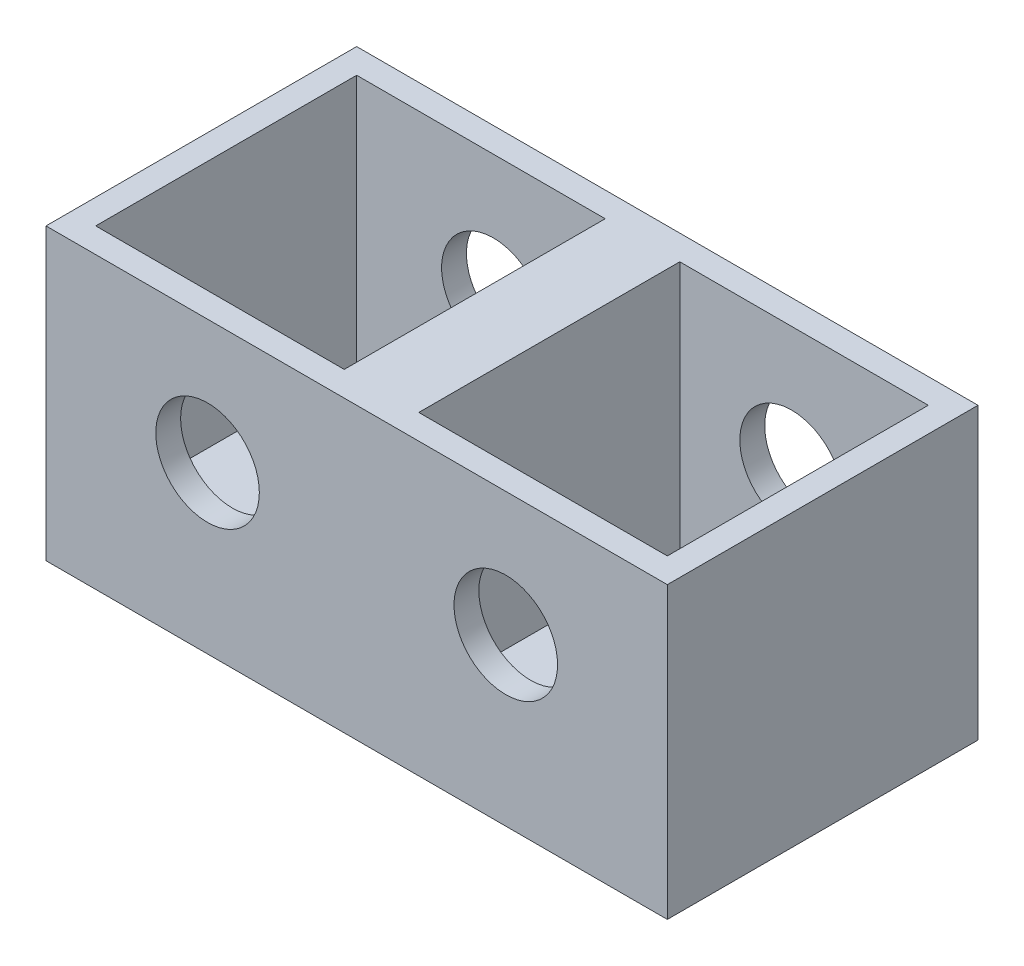
ISO-10303-21;
HEADER;
FILE_DESCRIPTION(('STEP AP214'),'2;1');
FILE_NAME('part.step','',(''),(''),'','','');
FILE_SCHEMA(('AUTOMOTIVE_DESIGN { 1 0 10303 214 1 1 1 1 }'));
ENDSEC;
DATA;
#1=APPLICATION_CONTEXT('core data for automotive mechanical design processes');
#2=APPLICATION_PROTOCOL_DEFINITION('international standard','automotive_design',2000,#1);
#3=PRODUCT_CONTEXT('',#1,'mechanical');
#4=PRODUCT('Part','Part','',(#3));
#5=PRODUCT_RELATED_PRODUCT_CATEGORY('part','',(#4));
#6=PRODUCT_DEFINITION_FORMATION('','',#4);
#7=PRODUCT_DEFINITION_CONTEXT('part definition',#1,'design');
#8=PRODUCT_DEFINITION('design','',#6,#7);
#9=PRODUCT_DEFINITION_SHAPE('','',#8);
#10=(LENGTH_UNIT() NAMED_UNIT(*) SI_UNIT(.MILLI.,.METRE.));
#11=(NAMED_UNIT(*) PLANE_ANGLE_UNIT() SI_UNIT($,.RADIAN.));
#12=(NAMED_UNIT(*) SI_UNIT($,.STERADIAN.) SOLID_ANGLE_UNIT());
#13=UNCERTAINTY_MEASURE_WITH_UNIT(LENGTH_MEASURE(1.E-05),#10,'distance_accuracy_value','');
#14=(GEOMETRIC_REPRESENTATION_CONTEXT(3) GLOBAL_UNCERTAINTY_ASSIGNED_CONTEXT((#13)) GLOBAL_UNIT_ASSIGNED_CONTEXT((#10,
#11,#12)) REPRESENTATION_CONTEXT('',''));
#15=CARTESIAN_POINT('',(0.,0.,0.));
#16=DIRECTION('',(0.,0.,1.));
#17=DIRECTION('',(1.,0.,0.));
#18=AXIS2_PLACEMENT_3D('',#15,#16,#17);
#19=CARTESIAN_POINT('',(15.,2.,7.5));
#20=DIRECTION('',(-1.,0.,0.));
#21=DIRECTION('',(0.,0.,1.));
#22=AXIS2_PLACEMENT_3D('',#19,#20,#21);
#23=PLANE('',#22);
#24=DIRECTION('',(0.,0.,-1.));
#25=VECTOR('',#24,1.);
#26=CARTESIAN_POINT('',(15.,0.,7.5));
#27=LINE('',#26,#25);
#28=CARTESIAN_POINT('',(15.,0.,7.5));
#29=VERTEX_POINT('',#28);
#30=CARTESIAN_POINT('',(15.,0.,-7.5));
#31=VERTEX_POINT('',#30);
#32=EDGE_CURVE('E224',#29,#31,#27,.T.);
#33=ORIENTED_EDGE('',*,*,#32,.T.);
#34=DIRECTION('',(0.,-1.,0.));
#35=VECTOR('',#34,1.);
#36=CARTESIAN_POINT('',(15.,2.,-7.5));
#37=LINE('',#36,#35);
#38=CARTESIAN_POINT('',(15.,14.,-7.5));
#39=VERTEX_POINT('',#38);
#40=EDGE_CURVE('E11',#39,#31,#37,.T.);
#41=ORIENTED_EDGE('',*,*,#40,.F.);
#42=DIRECTION('',(0.,0.,-1.));
#43=VECTOR('',#42,1.);
#44=CARTESIAN_POINT('',(15.,14.,0.));
#45=LINE('',#44,#43);
#46=CARTESIAN_POINT('',(15.,14.,7.5));
#47=VERTEX_POINT('',#46);
#48=EDGE_CURVE('E199',#47,#39,#45,.T.);
#49=ORIENTED_EDGE('',*,*,#48,.F.);
#50=DIRECTION('',(0.,-1.,0.));
#51=VECTOR('',#50,1.);
#52=CARTESIAN_POINT('',(15.,2.,7.5));
#53=LINE('',#52,#51);
#54=EDGE_CURVE('E233',#47,#29,#53,.T.);
#55=ORIENTED_EDGE('',*,*,#54,.T.);
#56=EDGE_LOOP('',(#33,#41,#49,#55));
#57=FACE_BOUND('',#56,.T.);
#58=ADVANCED_FACE('F40',(#57),#23,.F.);
#59=CARTESIAN_POINT('',(-15.,2.,-7.5));
#60=DIRECTION('',(0.,0.,1.));
#61=DIRECTION('',(1.,0.,0.));
#62=AXIS2_PLACEMENT_3D('',#59,#60,#61);
#63=PLANE('',#62);
#64=CARTESIAN_POINT('',(-7.2,8.,-7.5));
#65=DIRECTION('',(0.,0.,1.));
#66=DIRECTION('',(1.,0.,0.));
#67=AXIS2_PLACEMENT_3D('',#64,#65,#66);
#68=CIRCLE('',#67,2.5);
#69=CARTESIAN_POINT('',(-4.7,8.,-7.5));
#70=VERTEX_POINT('',#69);
#71=EDGE_CURVE('E167',#70,#70,#68,.T.);
#72=ORIENTED_EDGE('',*,*,#71,.T.);
#73=EDGE_LOOP('',(#72));
#74=FACE_BOUND('',#73,.T.);
#75=DIRECTION('',(0.,-1.,0.));
#76=VECTOR('',#75,1.);
#77=CARTESIAN_POINT('',(-15.,2.,-7.5));
#78=LINE('',#77,#76);
#79=CARTESIAN_POINT('',(-15.,14.,-7.5));
#80=VERTEX_POINT('',#79);
#81=CARTESIAN_POINT('',(-15.,0.,-7.5));
#82=VERTEX_POINT('',#81);
#83=EDGE_CURVE('E48',#80,#82,#78,.T.);
#84=ORIENTED_EDGE('',*,*,#83,.F.);
#85=DIRECTION('',(-1.,0.,0.));
#86=VECTOR('',#85,1.);
#87=CARTESIAN_POINT('',(-0.6,14.,-7.5));
#88=LINE('',#87,#86);
#89=EDGE_CURVE('E218',#39,#80,#88,.T.);
#90=ORIENTED_EDGE('',*,*,#89,.F.);
#91=ORIENTED_EDGE('',*,*,#40,.T.);
#92=DIRECTION('',(-1.,0.,0.));
#93=VECTOR('',#92,1.);
#94=CARTESIAN_POINT('',(-15.,0.,-7.5));
#95=LINE('',#94,#93);
#96=EDGE_CURVE('E227',#31,#82,#95,.T.);
#97=ORIENTED_EDGE('',*,*,#96,.T.);
#98=EDGE_LOOP('',(#84,#90,#91,#97));
#99=FACE_BOUND('',#98,.T.);
#100=CARTESIAN_POINT('',(7.2,8.,-7.5));
#101=DIRECTION('',(0.,0.,1.));
#102=DIRECTION('',(1.,0.,0.));
#103=AXIS2_PLACEMENT_3D('',#100,#101,#102);
#104=CIRCLE('',#103,2.5);
#105=CARTESIAN_POINT('',(9.7,8.,-7.5));
#106=VERTEX_POINT('',#105);
#107=EDGE_CURVE('E182',#106,#106,#104,.T.);
#108=ORIENTED_EDGE('',*,*,#107,.T.);
#109=EDGE_LOOP('',(#108));
#110=FACE_BOUND('',#109,.T.);
#111=ADVANCED_FACE('F264',(#74,#99,#110),#63,.F.);
#112=CARTESIAN_POINT('',(-15.,2.,7.5));
#113=DIRECTION('',(1.,0.,0.));
#114=DIRECTION('',(0.,0.,-1.));
#115=AXIS2_PLACEMENT_3D('',#112,#113,#114);
#116=PLANE('',#115);
#117=DIRECTION('',(0.,0.,1.));
#118=VECTOR('',#117,1.);
#119=CARTESIAN_POINT('',(-15.,0.,7.5));
#120=LINE('',#119,#118);
#121=CARTESIAN_POINT('',(-15.,0.,7.5));
#122=VERTEX_POINT('',#121);
#123=EDGE_CURVE('E229',#82,#122,#120,.T.);
#124=ORIENTED_EDGE('',*,*,#123,.T.);
#125=DIRECTION('',(0.,-1.,0.));
#126=VECTOR('',#125,1.);
#127=CARTESIAN_POINT('',(-15.,2.,7.5));
#128=LINE('',#127,#126);
#129=CARTESIAN_POINT('',(-15.,14.,7.5));
#130=VERTEX_POINT('',#129);
#131=EDGE_CURVE('E236',#130,#122,#128,.T.);
#132=ORIENTED_EDGE('',*,*,#131,.F.);
#133=DIRECTION('',(0.,0.,1.));
#134=VECTOR('',#133,1.);
#135=CARTESIAN_POINT('',(-15.,14.,0.));
#136=LINE('',#135,#134);
#137=EDGE_CURVE('E161',#80,#130,#136,.T.);
#138=ORIENTED_EDGE('',*,*,#137,.F.);
#139=ORIENTED_EDGE('',*,*,#83,.T.);
#140=EDGE_LOOP('',(#124,#132,#138,#139));
#141=FACE_BOUND('',#140,.T.);
#142=ADVANCED_FACE('F270',(#141),#116,.F.);
#143=CARTESIAN_POINT('',(-15.,2.,7.5));
#144=DIRECTION('',(0.,0.,-1.));
#145=DIRECTION('',(-1.,0.,0.));
#146=AXIS2_PLACEMENT_3D('',#143,#144,#145);
#147=PLANE('',#146);
#148=CARTESIAN_POINT('',(-7.2,8.,7.5));
#149=DIRECTION('',(0.,0.,1.));
#150=DIRECTION('',(1.,0.,0.));
#151=AXIS2_PLACEMENT_3D('',#148,#149,#150);
#152=CIRCLE('',#151,2.5);
#153=CARTESIAN_POINT('',(-4.7,8.,7.5));
#154=VERTEX_POINT('',#153);
#155=EDGE_CURVE('E356',#154,#154,#152,.T.);
#156=ORIENTED_EDGE('',*,*,#155,.F.);
#157=EDGE_LOOP('',(#156));
#158=FACE_BOUND('',#157,.T.);
#159=CARTESIAN_POINT('',(7.2,8.,7.5));
#160=DIRECTION('',(0.,0.,1.));
#161=DIRECTION('',(1.,0.,0.));
#162=AXIS2_PLACEMENT_3D('',#159,#160,#161);
#163=CIRCLE('',#162,2.5);
#164=CARTESIAN_POINT('',(9.7,8.,7.5));
#165=VERTEX_POINT('',#164);
#166=EDGE_CURVE('E141',#165,#165,#163,.T.);
#167=ORIENTED_EDGE('',*,*,#166,.F.);
#168=EDGE_LOOP('',(#167));
#169=FACE_BOUND('',#168,.T.);
#170=ORIENTED_EDGE('',*,*,#54,.F.);
#171=DIRECTION('',(1.,0.,0.));
#172=VECTOR('',#171,1.);
#173=CARTESIAN_POINT('',(-0.6,14.,7.5));
#174=LINE('',#173,#172);
#175=EDGE_CURVE('E221',#130,#47,#174,.T.);
#176=ORIENTED_EDGE('',*,*,#175,.F.);
#177=ORIENTED_EDGE('',*,*,#131,.T.);
#178=DIRECTION('',(1.,0.,0.));
#179=VECTOR('',#178,1.);
#180=CARTESIAN_POINT('',(-15.,0.,7.5));
#181=LINE('',#180,#179);
#182=EDGE_CURVE('E231',#122,#29,#181,.T.);
#183=ORIENTED_EDGE('',*,*,#182,.T.);
#184=EDGE_LOOP('',(#170,#176,#177,#183));
#185=FACE_BOUND('',#184,.T.);
#186=ADVANCED_FACE('F286',(#158,#169,#185),#147,.F.);
#187=CARTESIAN_POINT('',(0.,0.,0.));
#188=DIRECTION('',(0.,-1.,0.));
#189=DIRECTION('',(0.,0.,-1.));
#190=AXIS2_PLACEMENT_3D('',#187,#188,#189);
#191=PLANE('',#190);
#192=ORIENTED_EDGE('',*,*,#32,.F.);
#193=ORIENTED_EDGE('',*,*,#182,.F.);
#194=ORIENTED_EDGE('',*,*,#123,.F.);
#195=ORIENTED_EDGE('',*,*,#96,.F.);
#196=EDGE_LOOP('',(#192,#193,#194,#195));
#197=FACE_BOUND('',#196,.T.);
#198=ADVANCED_FACE('F277',(#197),#191,.T.);
#199=CARTESIAN_POINT('',(0.,14.,0.));
#200=DIRECTION('',(0.,-1.,0.));
#201=DIRECTION('',(0.,0.,-1.));
#202=AXIS2_PLACEMENT_3D('',#199,#200,#201);
#203=PLANE('',#202);
#204=ORIENTED_EDGE('',*,*,#175,.T.);
#205=ORIENTED_EDGE('',*,*,#48,.T.);
#206=ORIENTED_EDGE('',*,*,#89,.T.);
#207=ORIENTED_EDGE('',*,*,#137,.T.);
#208=EDGE_LOOP('',(#204,#205,#206,#207));
#209=FACE_BOUND('',#208,.T.);
#210=DIRECTION('',(-1.,0.,0.));
#211=VECTOR('',#210,1.);
#212=CARTESIAN_POINT('',(0.,14.,-6.3));
#213=LINE('',#212,#211);
#214=CARTESIAN_POINT('',(13.8,14.,-6.3));
#215=VERTEX_POINT('',#214);
#216=CARTESIAN_POINT('',(1.8,14.,-6.3));
#217=VERTEX_POINT('',#216);
#218=EDGE_CURVE('E186',#215,#217,#213,.T.);
#219=ORIENTED_EDGE('',*,*,#218,.F.);
#220=DIRECTION('',(0.,0.,-1.));
#221=VECTOR('',#220,1.);
#222=CARTESIAN_POINT('',(13.8,14.,0.));
#223=LINE('',#222,#221);
#224=CARTESIAN_POINT('',(13.8,14.,6.3));
#225=VERTEX_POINT('',#224);
#226=EDGE_CURVE('E189',#225,#215,#223,.T.);
#227=ORIENTED_EDGE('',*,*,#226,.F.);
#228=DIRECTION('',(1.,0.,0.));
#229=VECTOR('',#228,1.);
#230=CARTESIAN_POINT('',(0.,14.,6.3));
#231=LINE('',#230,#229);
#232=CARTESIAN_POINT('',(1.8,14.,6.3));
#233=VERTEX_POINT('',#232);
#234=EDGE_CURVE('E193',#233,#225,#231,.T.);
#235=ORIENTED_EDGE('',*,*,#234,.F.);
#236=DIRECTION('',(0.,0.,1.));
#237=VECTOR('',#236,1.);
#238=CARTESIAN_POINT('',(1.8,14.,0.));
#239=LINE('',#238,#237);
#240=EDGE_CURVE('E196',#217,#233,#239,.T.);
#241=ORIENTED_EDGE('',*,*,#240,.F.);
#242=EDGE_LOOP('',(#219,#227,#235,#241));
#243=FACE_BOUND('',#242,.T.);
#244=DIRECTION('',(1.,0.,0.));
#245=VECTOR('',#244,1.);
#246=CARTESIAN_POINT('',(0.,14.,6.3));
#247=LINE('',#246,#245);
#248=CARTESIAN_POINT('',(-13.8,14.,6.3));
#249=VERTEX_POINT('',#248);
#250=CARTESIAN_POINT('',(-1.8,14.,6.3));
#251=VERTEX_POINT('',#250);
#252=EDGE_CURVE('E133',#249,#251,#247,.T.);
#253=ORIENTED_EDGE('',*,*,#252,.F.);
#254=DIRECTION('',(0.,0.,1.));
#255=VECTOR('',#254,1.);
#256=CARTESIAN_POINT('',(-13.8,14.,0.));
#257=LINE('',#256,#255);
#258=CARTESIAN_POINT('',(-13.8,14.,-6.3));
#259=VERTEX_POINT('',#258);
#260=EDGE_CURVE('E148',#259,#249,#257,.T.);
#261=ORIENTED_EDGE('',*,*,#260,.F.);
#262=DIRECTION('',(-1.,0.,0.));
#263=VECTOR('',#262,1.);
#264=CARTESIAN_POINT('',(0.,14.,-6.3));
#265=LINE('',#264,#263);
#266=CARTESIAN_POINT('',(-1.8,14.,-6.3));
#267=VERTEX_POINT('',#266);
#268=EDGE_CURVE('E155',#267,#259,#265,.T.);
#269=ORIENTED_EDGE('',*,*,#268,.F.);
#270=DIRECTION('',(0.,0.,-1.));
#271=VECTOR('',#270,1.);
#272=CARTESIAN_POINT('',(-1.8,14.,0.));
#273=LINE('',#272,#271);
#274=EDGE_CURVE('E151',#251,#267,#273,.T.);
#275=ORIENTED_EDGE('',*,*,#274,.F.);
#276=EDGE_LOOP('',(#253,#261,#269,#275));
#277=FACE_BOUND('',#276,.T.);
#278=ADVANCED_FACE('F146',(#209,#243,#277),#203,.F.);
#279=CARTESIAN_POINT('',(0.,14.,-6.3));
#280=DIRECTION('',(0.,0.,1.));
#281=DIRECTION('',(1.,0.,0.));
#282=AXIS2_PLACEMENT_3D('',#279,#280,#281);
#283=PLANE('',#282);
#284=CARTESIAN_POINT('',(7.2,8.,-6.3));
#285=DIRECTION('',(0.,0.,1.));
#286=DIRECTION('',(1.,0.,0.));
#287=AXIS2_PLACEMENT_3D('',#284,#285,#286);
#288=CIRCLE('',#287,2.5);
#289=CARTESIAN_POINT('',(9.7,8.,-6.3));
#290=VERTEX_POINT('',#289);
#291=EDGE_CURVE('E179',#290,#290,#288,.T.);
#292=ORIENTED_EDGE('',*,*,#291,.F.);
#293=EDGE_LOOP('',(#292));
#294=FACE_BOUND('',#293,.T.);
#295=DIRECTION('',(-1.,0.,0.));
#296=VECTOR('',#295,1.);
#297=CARTESIAN_POINT('',(0.,2.,-6.3));
#298=LINE('',#297,#296);
#299=CARTESIAN_POINT('',(13.8,2.,-6.3));
#300=VERTEX_POINT('',#299);
#301=CARTESIAN_POINT('',(1.8,2.,-6.3));
#302=VERTEX_POINT('',#301);
#303=EDGE_CURVE('E185',#300,#302,#298,.T.);
#304=ORIENTED_EDGE('',*,*,#303,.F.);
#305=DIRECTION('',(0.,-1.,0.));
#306=VECTOR('',#305,1.);
#307=CARTESIAN_POINT('',(13.8,14.,-6.3));
#308=LINE('',#307,#306);
#309=EDGE_CURVE('E216',#215,#300,#308,.T.);
#310=ORIENTED_EDGE('',*,*,#309,.F.);
#311=ORIENTED_EDGE('',*,*,#218,.T.);
#312=DIRECTION('',(0.,-1.,0.));
#313=VECTOR('',#312,1.);
#314=CARTESIAN_POINT('',(1.8,14.,-6.3));
#315=LINE('',#314,#313);
#316=EDGE_CURVE('E202',#217,#302,#315,.T.);
#317=ORIENTED_EDGE('',*,*,#316,.T.);
#318=EDGE_LOOP('',(#304,#310,#311,#317));
#319=FACE_BOUND('',#318,.T.);
#320=ADVANCED_FACE('F260',(#294,#319),#283,.T.);
#321=CARTESIAN_POINT('',(13.8,14.,0.));
#322=DIRECTION('',(-1.,0.,0.));
#323=DIRECTION('',(0.,0.,1.));
#324=AXIS2_PLACEMENT_3D('',#321,#322,#323);
#325=PLANE('',#324);
#326=DIRECTION('',(0.,0.,-1.));
#327=VECTOR('',#326,1.);
#328=CARTESIAN_POINT('',(13.8,2.,0.));
#329=LINE('',#328,#327);
#330=CARTESIAN_POINT('',(13.8,2.,6.3));
#331=VERTEX_POINT('',#330);
#332=EDGE_CURVE('E205',#331,#300,#329,.T.);
#333=ORIENTED_EDGE('',*,*,#332,.F.);
#334=DIRECTION('',(0.,-1.,0.));
#335=VECTOR('',#334,1.);
#336=CARTESIAN_POINT('',(13.8,14.,6.3));
#337=LINE('',#336,#335);
#338=EDGE_CURVE('E214',#225,#331,#337,.T.);
#339=ORIENTED_EDGE('',*,*,#338,.F.);
#340=ORIENTED_EDGE('',*,*,#226,.T.);
#341=ORIENTED_EDGE('',*,*,#309,.T.);
#342=EDGE_LOOP('',(#333,#339,#340,#341));
#343=FACE_BOUND('',#342,.T.);
#344=ADVANCED_FACE('F249',(#343),#325,.T.);
#345=CARTESIAN_POINT('',(0.,14.,6.3));
#346=DIRECTION('',(0.,0.,-1.));
#347=DIRECTION('',(-1.,0.,0.));
#348=AXIS2_PLACEMENT_3D('',#345,#346,#347);
#349=PLANE('',#348);
#350=CARTESIAN_POINT('',(7.2,8.,6.3));
#351=DIRECTION('',(0.,0.,-1.));
#352=DIRECTION('',(-1.,0.,0.));
#353=AXIS2_PLACEMENT_3D('',#350,#351,#352);
#354=CIRCLE('',#353,2.5);
#355=CARTESIAN_POINT('',(4.7,8.,6.3));
#356=VERTEX_POINT('',#355);
#357=EDGE_CURVE('E178',#356,#356,#354,.T.);
#358=ORIENTED_EDGE('',*,*,#357,.F.);
#359=EDGE_LOOP('',(#358));
#360=FACE_BOUND('',#359,.T.);
#361=DIRECTION('',(1.,0.,0.));
#362=VECTOR('',#361,1.);
#363=CARTESIAN_POINT('',(0.,2.,6.3));
#364=LINE('',#363,#362);
#365=CARTESIAN_POINT('',(1.8,2.,6.3));
#366=VERTEX_POINT('',#365);
#367=EDGE_CURVE('E64',#366,#331,#364,.T.);
#368=ORIENTED_EDGE('',*,*,#367,.F.);
#369=DIRECTION('',(0.,-1.,0.));
#370=VECTOR('',#369,1.);
#371=CARTESIAN_POINT('',(1.8,14.,6.3));
#372=LINE('',#371,#370);
#373=EDGE_CURVE('E212',#233,#366,#372,.T.);
#374=ORIENTED_EDGE('',*,*,#373,.F.);
#375=ORIENTED_EDGE('',*,*,#234,.T.);
#376=ORIENTED_EDGE('',*,*,#338,.T.);
#377=EDGE_LOOP('',(#368,#374,#375,#376));
#378=FACE_BOUND('',#377,.T.);
#379=ADVANCED_FACE('F246',(#360,#378),#349,.T.);
#380=CARTESIAN_POINT('',(1.8,14.,0.));
#381=DIRECTION('',(1.,0.,0.));
#382=DIRECTION('',(0.,0.,-1.));
#383=AXIS2_PLACEMENT_3D('',#380,#381,#382);
#384=PLANE('',#383);
#385=DIRECTION('',(0.,0.,1.));
#386=VECTOR('',#385,1.);
#387=CARTESIAN_POINT('',(1.8,2.,0.));
#388=LINE('',#387,#386);
#389=EDGE_CURVE('E190',#302,#366,#388,.T.);
#390=ORIENTED_EDGE('',*,*,#389,.F.);
#391=ORIENTED_EDGE('',*,*,#316,.F.);
#392=ORIENTED_EDGE('',*,*,#240,.T.);
#393=ORIENTED_EDGE('',*,*,#373,.T.);
#394=EDGE_LOOP('',(#390,#391,#392,#393));
#395=FACE_BOUND('',#394,.T.);
#396=ADVANCED_FACE('F248',(#395),#384,.T.);
#397=CARTESIAN_POINT('',(0.,2.,0.));
#398=DIRECTION('',(0.,-1.,0.));
#399=DIRECTION('',(0.,0.,-1.));
#400=AXIS2_PLACEMENT_3D('',#397,#398,#399);
#401=PLANE('',#400);
#402=ORIENTED_EDGE('',*,*,#332,.T.);
#403=ORIENTED_EDGE('',*,*,#303,.T.);
#404=ORIENTED_EDGE('',*,*,#389,.T.);
#405=ORIENTED_EDGE('',*,*,#367,.T.);
#406=EDGE_LOOP('',(#402,#403,#404,#405));
#407=FACE_BOUND('',#406,.T.);
#408=ADVANCED_FACE('F256',(#407),#401,.F.);
#409=CARTESIAN_POINT('',(7.2,8.,-8.5));
#410=DIRECTION('',(0.,0.,1.));
#411=DIRECTION('',(1.,0.,0.));
#412=AXIS2_PLACEMENT_3D('',#409,#410,#411);
#413=CYLINDRICAL_SURFACE('',#412,2.5);
#414=ORIENTED_EDGE('',*,*,#357,.T.);
#415=EDGE_LOOP('',(#414));
#416=FACE_BOUND('',#415,.T.);
#417=ORIENTED_EDGE('',*,*,#166,.T.);
#418=EDGE_LOOP('',(#417));
#419=FACE_BOUND('',#418,.T.);
#420=ADVANCED_FACE('F243',(#416,#419),#413,.F.);
#421=ORIENTED_EDGE('',*,*,#291,.T.);
#422=EDGE_LOOP('',(#421));
#423=FACE_BOUND('',#422,.T.);
#424=ORIENTED_EDGE('',*,*,#107,.F.);
#425=EDGE_LOOP('',(#424));
#426=FACE_BOUND('',#425,.T.);
#427=ADVANCED_FACE('F317',(#423,#426),#413,.F.);
#428=CARTESIAN_POINT('',(0.,14.,6.3));
#429=DIRECTION('',(0.,0.,-1.));
#430=DIRECTION('',(-1.,0.,0.));
#431=AXIS2_PLACEMENT_3D('',#428,#429,#430);
#432=PLANE('',#431);
#433=CARTESIAN_POINT('',(-7.2,8.,6.3));
#434=DIRECTION('',(0.,0.,-1.));
#435=DIRECTION('',(-1.,0.,0.));
#436=AXIS2_PLACEMENT_3D('',#433,#434,#435);
#437=CIRCLE('',#436,2.5);
#438=CARTESIAN_POINT('',(-9.7,8.,6.3));
#439=VERTEX_POINT('',#438);
#440=EDGE_CURVE('E352',#439,#439,#437,.T.);
#441=ORIENTED_EDGE('',*,*,#440,.F.);
#442=EDGE_LOOP('',(#441));
#443=FACE_BOUND('',#442,.T.);
#444=DIRECTION('',(1.,0.,0.));
#445=VECTOR('',#444,1.);
#446=CARTESIAN_POINT('',(0.,2.,6.3));
#447=LINE('',#446,#445);
#448=CARTESIAN_POINT('',(-13.8,2.,6.3));
#449=VERTEX_POINT('',#448);
#450=CARTESIAN_POINT('',(-1.8,2.,6.3));
#451=VERTEX_POINT('',#450);
#452=EDGE_CURVE('E136',#449,#451,#447,.T.);
#453=ORIENTED_EDGE('',*,*,#452,.F.);
#454=DIRECTION('',(0.,-1.,0.));
#455=VECTOR('',#454,1.);
#456=CARTESIAN_POINT('',(-13.8,14.,6.3));
#457=LINE('',#456,#455);
#458=EDGE_CURVE('E130',#249,#449,#457,.T.);
#459=ORIENTED_EDGE('',*,*,#458,.F.);
#460=ORIENTED_EDGE('',*,*,#252,.T.);
#461=DIRECTION('',(0.,-1.,0.));
#462=VECTOR('',#461,1.);
#463=CARTESIAN_POINT('',(-1.8,14.,6.3));
#464=LINE('',#463,#462);
#465=EDGE_CURVE('E164',#251,#451,#464,.T.);
#466=ORIENTED_EDGE('',*,*,#465,.T.);
#467=EDGE_LOOP('',(#453,#459,#460,#466));
#468=FACE_BOUND('',#467,.T.);
#469=ADVANCED_FACE('F132',(#443,#468),#432,.T.);
#470=CARTESIAN_POINT('',(-13.8,14.,0.));
#471=DIRECTION('',(1.,0.,0.));
#472=DIRECTION('',(0.,0.,-1.));
#473=AXIS2_PLACEMENT_3D('',#470,#471,#472);
#474=PLANE('',#473);
#475=DIRECTION('',(0.,0.,1.));
#476=VECTOR('',#475,1.);
#477=CARTESIAN_POINT('',(-13.8,2.,0.));
#478=LINE('',#477,#476);
#479=CARTESIAN_POINT('',(-13.8,2.,-6.3));
#480=VERTEX_POINT('',#479);
#481=EDGE_CURVE('E166',#480,#449,#478,.T.);
#482=ORIENTED_EDGE('',*,*,#481,.F.);
#483=DIRECTION('',(0.,-1.,0.));
#484=VECTOR('',#483,1.);
#485=CARTESIAN_POINT('',(-13.8,14.,-6.3));
#486=LINE('',#485,#484);
#487=EDGE_CURVE('E142',#259,#480,#486,.T.);
#488=ORIENTED_EDGE('',*,*,#487,.F.);
#489=ORIENTED_EDGE('',*,*,#260,.T.);
#490=ORIENTED_EDGE('',*,*,#458,.T.);
#491=EDGE_LOOP('',(#482,#488,#489,#490));
#492=FACE_BOUND('',#491,.T.);
#493=ADVANCED_FACE('F154',(#492),#474,.T.);
#494=CARTESIAN_POINT('',(0.,14.,-6.3));
#495=DIRECTION('',(0.,0.,1.));
#496=DIRECTION('',(1.,0.,0.));
#497=AXIS2_PLACEMENT_3D('',#494,#495,#496);
#498=PLANE('',#497);
#499=CARTESIAN_POINT('',(-7.2,8.,-6.3));
#500=DIRECTION('',(0.,0.,1.));
#501=DIRECTION('',(1.,0.,0.));
#502=AXIS2_PLACEMENT_3D('',#499,#500,#501);
#503=CIRCLE('',#502,2.5);
#504=CARTESIAN_POINT('',(-4.7,8.,-6.3));
#505=VERTEX_POINT('',#504);
#506=EDGE_CURVE('E43',#505,#505,#503,.T.);
#507=ORIENTED_EDGE('',*,*,#506,.F.);
#508=EDGE_LOOP('',(#507));
#509=FACE_BOUND('',#508,.T.);
#510=DIRECTION('',(-1.,0.,0.));
#511=VECTOR('',#510,1.);
#512=CARTESIAN_POINT('',(0.,2.,-6.3));
#513=LINE('',#512,#511);
#514=CARTESIAN_POINT('',(-1.8,2.,-6.3));
#515=VERTEX_POINT('',#514);
#516=EDGE_CURVE('E56',#515,#480,#513,.T.);
#517=ORIENTED_EDGE('',*,*,#516,.F.);
#518=DIRECTION('',(0.,-1.,0.));
#519=VECTOR('',#518,1.);
#520=CARTESIAN_POINT('',(-1.8,14.,-6.3));
#521=LINE('',#520,#519);
#522=EDGE_CURVE('E173',#267,#515,#521,.T.);
#523=ORIENTED_EDGE('',*,*,#522,.F.);
#524=ORIENTED_EDGE('',*,*,#268,.T.);
#525=ORIENTED_EDGE('',*,*,#487,.T.);
#526=EDGE_LOOP('',(#517,#523,#524,#525));
#527=FACE_BOUND('',#526,.T.);
#528=ADVANCED_FACE('F329',(#509,#527),#498,.T.);
#529=CARTESIAN_POINT('',(-1.8,14.,0.));
#530=DIRECTION('',(-1.,0.,0.));
#531=DIRECTION('',(0.,0.,1.));
#532=AXIS2_PLACEMENT_3D('',#529,#530,#531);
#533=PLANE('',#532);
#534=DIRECTION('',(0.,0.,-1.));
#535=VECTOR('',#534,1.);
#536=CARTESIAN_POINT('',(-1.8,2.,0.));
#537=LINE('',#536,#535);
#538=EDGE_CURVE('E152',#451,#515,#537,.T.);
#539=ORIENTED_EDGE('',*,*,#538,.F.);
#540=ORIENTED_EDGE('',*,*,#465,.F.);
#541=ORIENTED_EDGE('',*,*,#274,.T.);
#542=ORIENTED_EDGE('',*,*,#522,.T.);
#543=EDGE_LOOP('',(#539,#540,#541,#542));
#544=FACE_BOUND('',#543,.T.);
#545=ADVANCED_FACE('F332',(#544),#533,.T.);
#546=ORIENTED_EDGE('',*,*,#481,.T.);
#547=ORIENTED_EDGE('',*,*,#452,.T.);
#548=ORIENTED_EDGE('',*,*,#538,.T.);
#549=ORIENTED_EDGE('',*,*,#516,.T.);
#550=EDGE_LOOP('',(#546,#547,#548,#549));
#551=FACE_BOUND('',#550,.T.);
#552=ADVANCED_FACE('F302',(#551),#401,.F.);
#553=CARTESIAN_POINT('',(-7.2,8.,-8.5));
#554=DIRECTION('',(0.,0.,1.));
#555=DIRECTION('',(1.,0.,0.));
#556=AXIS2_PLACEMENT_3D('',#553,#554,#555);
#557=CYLINDRICAL_SURFACE('',#556,2.5);
#558=ORIENTED_EDGE('',*,*,#506,.T.);
#559=EDGE_LOOP('',(#558));
#560=FACE_BOUND('',#559,.T.);
#561=ORIENTED_EDGE('',*,*,#71,.F.);
#562=EDGE_LOOP('',(#561));
#563=FACE_BOUND('',#562,.T.);
#564=ADVANCED_FACE('F337',(#560,#563),#557,.F.);
#565=ORIENTED_EDGE('',*,*,#440,.T.);
#566=EDGE_LOOP('',(#565));
#567=FACE_BOUND('',#566,.T.);
#568=ORIENTED_EDGE('',*,*,#155,.T.);
#569=EDGE_LOOP('',(#568));
#570=FACE_BOUND('',#569,.T.);
#571=ADVANCED_FACE('F339',(#567,#570),#557,.F.);
#572=CLOSED_SHELL('',(#58,#111,#142,#186,#198,#278,#320,#344,#379,#396,#408,#420,#427,#469,#493,
#528,#545,#552,#564,#571));
#573=MANIFOLD_SOLID_BREP('B2',#572);
#574=ADVANCED_BREP_SHAPE_REPRESENTATION('',(#18,#573),#14);
#575=SHAPE_DEFINITION_REPRESENTATION(#9,#574);
ENDSEC;
END-ISO-10303-21;
